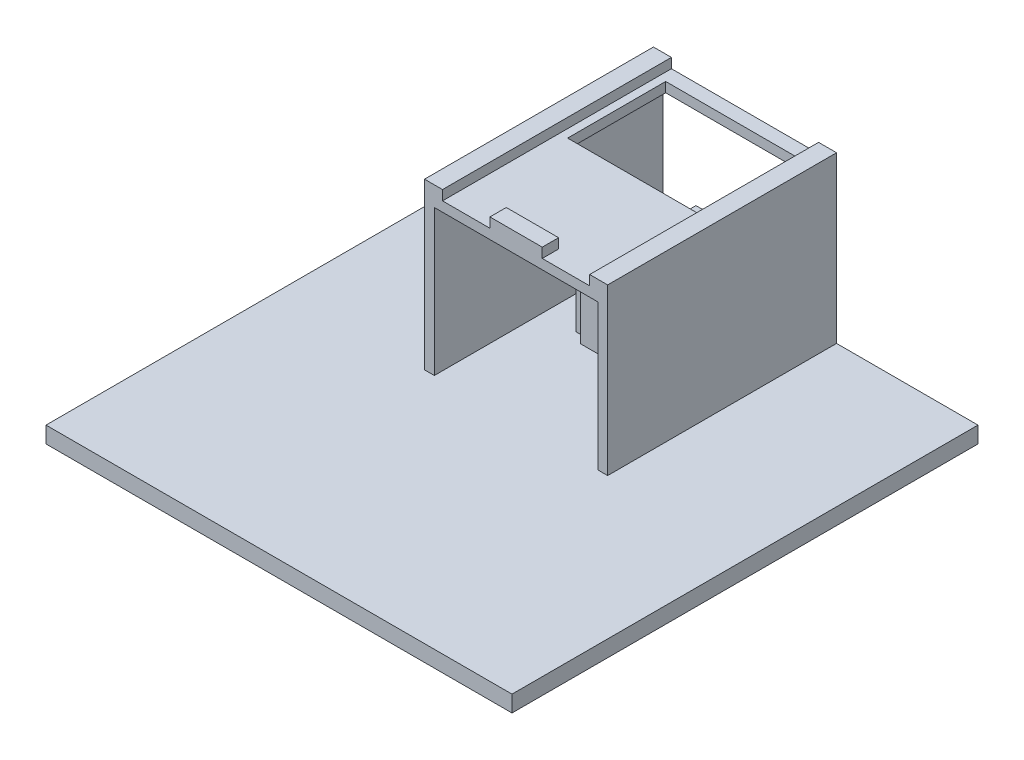
ISO-10303-21;
HEADER;
FILE_DESCRIPTION(('STEP AP214'),'2;1');
FILE_NAME('part.step','',(''),(''),'','','');
FILE_SCHEMA(('AUTOMOTIVE_DESIGN { 1 0 10303 214 1 1 1 1 }'));
ENDSEC;
DATA;
#1=APPLICATION_CONTEXT('core data for automotive mechanical design processes');
#2=APPLICATION_PROTOCOL_DEFINITION('international standard','automotive_design',2000,#1);
#3=PRODUCT_CONTEXT('',#1,'mechanical');
#4=PRODUCT('Part','Part','',(#3));
#5=PRODUCT_RELATED_PRODUCT_CATEGORY('part','',(#4));
#6=PRODUCT_DEFINITION_FORMATION('','',#4);
#7=PRODUCT_DEFINITION_CONTEXT('part definition',#1,'design');
#8=PRODUCT_DEFINITION('design','',#6,#7);
#9=PRODUCT_DEFINITION_SHAPE('','',#8);
#10=(LENGTH_UNIT() NAMED_UNIT(*) SI_UNIT(.MILLI.,.METRE.));
#11=(NAMED_UNIT(*) PLANE_ANGLE_UNIT() SI_UNIT($,.RADIAN.));
#12=(NAMED_UNIT(*) SI_UNIT($,.STERADIAN.) SOLID_ANGLE_UNIT());
#13=UNCERTAINTY_MEASURE_WITH_UNIT(LENGTH_MEASURE(1.E-05),#10,'distance_accuracy_value','');
#14=(GEOMETRIC_REPRESENTATION_CONTEXT(3) GLOBAL_UNCERTAINTY_ASSIGNED_CONTEXT((#13)) GLOBAL_UNIT_ASSIGNED_CONTEXT((#10,
#11,#12)) REPRESENTATION_CONTEXT('',''));
#15=CARTESIAN_POINT('',(0.,0.,0.));
#16=DIRECTION('',(0.,0.,1.));
#17=DIRECTION('',(1.,0.,0.));
#18=AXIS2_PLACEMENT_3D('',#15,#16,#17);
#19=CARTESIAN_POINT('',(9.,-3.6,28.));
#20=DIRECTION('',(0.,-1.,0.));
#21=DIRECTION('',(1.,0.,0.));
#22=AXIS2_PLACEMENT_3D('',#19,#20,#21);
#23=PLANE('',#22);
#24=DIRECTION('',(0.,0.,-1.));
#25=VECTOR('',#24,1.);
#26=CARTESIAN_POINT('',(-5.4,-3.6,15.7));
#27=LINE('',#26,#25);
#28=CARTESIAN_POINT('',(-5.4,-3.6,15.7));
#29=VERTEX_POINT('',#28);
#30=CARTESIAN_POINT('',(-5.4,-3.6,13.7));
#31=VERTEX_POINT('',#30);
#32=EDGE_CURVE('E366',#29,#31,#27,.T.);
#33=ORIENTED_EDGE('',*,*,#32,.F.);
#34=DIRECTION('',(1.,0.,0.));
#35=VECTOR('',#34,1.);
#36=CARTESIAN_POINT('',(3.4,-3.6,15.7));
#37=LINE('',#36,#35);
#38=CARTESIAN_POINT('',(3.4,-3.6,15.7));
#39=VERTEX_POINT('',#38);
#40=EDGE_CURVE('E358',#29,#39,#37,.T.);
#41=ORIENTED_EDGE('',*,*,#40,.T.);
#42=DIRECTION('',(0.,0.,-1.));
#43=VECTOR('',#42,1.);
#44=CARTESIAN_POINT('',(3.4,-3.6,15.7));
#45=LINE('',#44,#43);
#46=CARTESIAN_POINT('',(3.4,-3.6,13.7));
#47=VERTEX_POINT('',#46);
#48=EDGE_CURVE('E370',#39,#47,#45,.T.);
#49=ORIENTED_EDGE('',*,*,#48,.T.);
#50=DIRECTION('',(1.,0.,0.));
#51=VECTOR('',#50,1.);
#52=CARTESIAN_POINT('',(-9.,-3.6,13.7));
#53=LINE('',#52,#51);
#54=CARTESIAN_POINT('',(7.,-3.6,13.7));
#55=VERTEX_POINT('',#54);
#56=EDGE_CURVE('E379',#47,#55,#53,.T.);
#57=ORIENTED_EDGE('',*,*,#56,.T.);
#58=DIRECTION('',(0.,0.,-1.));
#59=VECTOR('',#58,1.);
#60=CARTESIAN_POINT('',(7.,-3.6,1.7));
#61=LINE('',#60,#59);
#62=CARTESIAN_POINT('',(7.,-3.6,1.7));
#63=VERTEX_POINT('',#62);
#64=EDGE_CURVE('E384',#55,#63,#61,.T.);
#65=ORIENTED_EDGE('',*,*,#64,.T.);
#66=DIRECTION('',(-1.,0.,0.));
#67=VECTOR('',#66,1.);
#68=CARTESIAN_POINT('',(-9.,-3.6,1.7));
#69=LINE('',#68,#67);
#70=CARTESIAN_POINT('',(-9.,-3.6,1.7));
#71=VERTEX_POINT('',#70);
#72=EDGE_CURVE('E387',#63,#71,#69,.T.);
#73=ORIENTED_EDGE('',*,*,#72,.T.);
#74=DIRECTION('',(0.,0.,1.));
#75=VECTOR('',#74,1.);
#76=CARTESIAN_POINT('',(-9.,-3.6,1.7));
#77=LINE('',#76,#75);
#78=CARTESIAN_POINT('',(-9.,-3.6,13.7));
#79=VERTEX_POINT('',#78);
#80=EDGE_CURVE('E376',#71,#79,#77,.T.);
#81=ORIENTED_EDGE('',*,*,#80,.T.);
#82=EDGE_CURVE('E381',#79,#31,#53,.T.);
#83=ORIENTED_EDGE('',*,*,#82,.T.);
#84=EDGE_LOOP('',(#33,#41,#49,#57,#65,#73,#81,#83));
#85=FACE_BOUND('',#84,.T.);
#86=DIRECTION('',(-1.,0.,0.));
#87=VECTOR('',#86,1.);
#88=CARTESIAN_POINT('',(9.,-3.6,0.));
#89=LINE('',#88,#87);
#90=CARTESIAN_POINT('',(9.,-3.6,0.));
#91=VERTEX_POINT('',#90);
#92=CARTESIAN_POINT('',(-11.,-3.6,0.));
#93=VERTEX_POINT('',#92);
#94=EDGE_CURVE('E417',#91,#93,#89,.T.);
#95=ORIENTED_EDGE('',*,*,#94,.F.);
#96=DIRECTION('',(0.,0.,-1.));
#97=VECTOR('',#96,1.);
#98=CARTESIAN_POINT('',(9.,-3.6,28.));
#99=LINE('',#98,#97);
#100=CARTESIAN_POINT('',(9.,-3.6,28.));
#101=VERTEX_POINT('',#100);
#102=EDGE_CURVE('E11',#101,#91,#99,.T.);
#103=ORIENTED_EDGE('',*,*,#102,.F.);
#104=DIRECTION('',(-1.,0.,0.));
#105=VECTOR('',#104,1.);
#106=CARTESIAN_POINT('',(9.,-3.6,28.));
#107=LINE('',#106,#105);
#108=CARTESIAN_POINT('',(-11.,-3.6,28.));
#109=VERTEX_POINT('',#108);
#110=EDGE_CURVE('E419',#101,#109,#107,.T.);
#111=ORIENTED_EDGE('',*,*,#110,.T.);
#112=DIRECTION('',(0.,0.,-1.));
#113=VECTOR('',#112,1.);
#114=CARTESIAN_POINT('',(-11.,-3.6,28.));
#115=LINE('',#114,#113);
#116=EDGE_CURVE('E42',#109,#93,#115,.T.);
#117=ORIENTED_EDGE('',*,*,#116,.T.);
#118=EDGE_LOOP('',(#95,#103,#111,#117));
#119=FACE_BOUND('',#118,.T.);
#120=ADVANCED_FACE('F39',(#85,#119),#23,.T.);
#121=CARTESIAN_POINT('',(9.,-3.6,28.));
#122=DIRECTION('',(1.,0.,0.));
#123=DIRECTION('',(0.,1.,0.));
#124=AXIS2_PLACEMENT_3D('',#121,#122,#123);
#125=PLANE('',#124);
#126=DIRECTION('',(0.,-1.,0.));
#127=VECTOR('',#126,1.);
#128=CARTESIAN_POINT('',(9.,-3.6,0.));
#129=LINE('',#128,#127);
#130=CARTESIAN_POINT('',(9.,-21.4,0.));
#131=VERTEX_POINT('',#130);
#132=EDGE_CURVE('E423',#91,#131,#129,.T.);
#133=ORIENTED_EDGE('',*,*,#132,.T.);
#134=DIRECTION('',(0.,0.,-1.));
#135=VECTOR('',#134,1.);
#136=CARTESIAN_POINT('',(9.,-21.4,28.));
#137=LINE('',#136,#135);
#138=CARTESIAN_POINT('',(9.,-21.4,28.));
#139=VERTEX_POINT('',#138);
#140=EDGE_CURVE('E47',#139,#131,#137,.T.);
#141=ORIENTED_EDGE('',*,*,#140,.F.);
#142=DIRECTION('',(0.,-1.,0.));
#143=VECTOR('',#142,1.);
#144=CARTESIAN_POINT('',(9.,-3.6,28.));
#145=LINE('',#144,#143);
#146=EDGE_CURVE('E458',#101,#139,#145,.T.);
#147=ORIENTED_EDGE('',*,*,#146,.F.);
#148=ORIENTED_EDGE('',*,*,#102,.T.);
#149=EDGE_LOOP('',(#133,#141,#147,#148));
#150=FACE_BOUND('',#149,.T.);
#151=ADVANCED_FACE('F540',(#150),#125,.F.);
#152=CARTESIAN_POINT('',(10.2,-1.2,28.));
#153=DIRECTION('',(1.,0.,0.));
#154=DIRECTION('',(0.,1.,0.));
#155=AXIS2_PLACEMENT_3D('',#152,#153,#154);
#156=PLANE('',#155);
#157=DIRECTION('',(0.,-1.,0.));
#158=VECTOR('',#157,1.);
#159=CARTESIAN_POINT('',(10.2,-1.2,0.));
#160=LINE('',#159,#158);
#161=CARTESIAN_POINT('',(10.2,-1.2,0.));
#162=VERTEX_POINT('',#161);
#163=CARTESIAN_POINT('',(10.2,-21.4,0.));
#164=VERTEX_POINT('',#163);
#165=EDGE_CURVE('E480',#162,#164,#160,.T.);
#166=ORIENTED_EDGE('',*,*,#165,.F.);
#167=DIRECTION('',(0.,0.,-1.));
#168=VECTOR('',#167,1.);
#169=CARTESIAN_POINT('',(10.2,-1.2,28.));
#170=LINE('',#169,#168);
#171=CARTESIAN_POINT('',(10.2,-1.2,28.));
#172=VERTEX_POINT('',#171);
#173=EDGE_CURVE('E490',#172,#162,#170,.T.);
#174=ORIENTED_EDGE('',*,*,#173,.F.);
#175=DIRECTION('',(0.,-1.,0.));
#176=VECTOR('',#175,1.);
#177=CARTESIAN_POINT('',(10.2,-1.2,28.));
#178=LINE('',#177,#176);
#179=CARTESIAN_POINT('',(10.2,-21.4,28.));
#180=VERTEX_POINT('',#179);
#181=EDGE_CURVE('E453',#172,#180,#178,.T.);
#182=ORIENTED_EDGE('',*,*,#181,.T.);
#183=DIRECTION('',(0.,0.,-1.));
#184=VECTOR('',#183,1.);
#185=CARTESIAN_POINT('',(10.2,-21.4,28.));
#186=LINE('',#185,#184);
#187=EDGE_CURVE('E487',#180,#164,#186,.T.);
#188=ORIENTED_EDGE('',*,*,#187,.T.);
#189=EDGE_LOOP('',(#166,#174,#182,#188));
#190=FACE_BOUND('',#189,.T.);
#191=ADVANCED_FACE('F551',(#190),#156,.T.);
#192=CARTESIAN_POINT('',(8.,-1.2,28.));
#193=DIRECTION('',(0.,1.,0.));
#194=DIRECTION('',(-1.,0.,0.));
#195=AXIS2_PLACEMENT_3D('',#192,#193,#194);
#196=PLANE('',#195);
#197=DIRECTION('',(1.,0.,0.));
#198=VECTOR('',#197,1.);
#199=CARTESIAN_POINT('',(8.,-1.2,0.));
#200=LINE('',#199,#198);
#201=CARTESIAN_POINT('',(8.,-1.2,0.));
#202=VERTEX_POINT('',#201);
#203=EDGE_CURVE('E477',#202,#162,#200,.T.);
#204=ORIENTED_EDGE('',*,*,#203,.F.);
#205=DIRECTION('',(0.,0.,-1.));
#206=VECTOR('',#205,1.);
#207=CARTESIAN_POINT('',(8.,-1.2,28.));
#208=LINE('',#207,#206);
#209=CARTESIAN_POINT('',(8.,-1.2,28.));
#210=VERTEX_POINT('',#209);
#211=EDGE_CURVE('E492',#210,#202,#208,.T.);
#212=ORIENTED_EDGE('',*,*,#211,.F.);
#213=DIRECTION('',(1.,0.,0.));
#214=VECTOR('',#213,1.);
#215=CARTESIAN_POINT('',(8.,-1.2,28.));
#216=LINE('',#215,#214);
#217=EDGE_CURVE('E450',#210,#172,#216,.T.);
#218=ORIENTED_EDGE('',*,*,#217,.T.);
#219=ORIENTED_EDGE('',*,*,#173,.T.);
#220=EDGE_LOOP('',(#204,#212,#218,#219));
#221=FACE_BOUND('',#220,.T.);
#222=ADVANCED_FACE('F557',(#221),#196,.T.);
#223=CARTESIAN_POINT('',(8.,-2.4,28.));
#224=DIRECTION('',(-1.,0.,0.));
#225=DIRECTION('',(0.,0.,1.));
#226=AXIS2_PLACEMENT_3D('',#223,#224,#225);
#227=PLANE('',#226);
#228=DIRECTION('',(0.,1.,0.));
#229=VECTOR('',#228,1.);
#230=CARTESIAN_POINT('',(8.,-2.4,0.));
#231=LINE('',#230,#229);
#232=CARTESIAN_POINT('',(8.,-2.4,0.));
#233=VERTEX_POINT('',#232);
#234=EDGE_CURVE('E474',#233,#202,#231,.T.);
#235=ORIENTED_EDGE('',*,*,#234,.F.);
#236=DIRECTION('',(0.,0.,-1.));
#237=VECTOR('',#236,1.);
#238=CARTESIAN_POINT('',(8.,-2.4,28.));
#239=LINE('',#238,#237);
#240=CARTESIAN_POINT('',(8.,-2.4,28.));
#241=VERTEX_POINT('',#240);
#242=EDGE_CURVE('E494',#241,#233,#239,.T.);
#243=ORIENTED_EDGE('',*,*,#242,.F.);
#244=DIRECTION('',(0.,1.,0.));
#245=VECTOR('',#244,1.);
#246=CARTESIAN_POINT('',(8.,-2.4,28.));
#247=LINE('',#246,#245);
#248=EDGE_CURVE('E447',#241,#210,#247,.T.);
#249=ORIENTED_EDGE('',*,*,#248,.T.);
#250=ORIENTED_EDGE('',*,*,#211,.T.);
#251=EDGE_LOOP('',(#235,#243,#249,#250));
#252=FACE_BOUND('',#251,.T.);
#253=ADVANCED_FACE('F560',(#252),#227,.T.);
#254=CARTESIAN_POINT('',(2.2,-2.4,28.));
#255=DIRECTION('',(0.,1.,0.));
#256=DIRECTION('',(-1.,0.,0.));
#257=AXIS2_PLACEMENT_3D('',#254,#255,#256);
#258=PLANE('',#257);
#259=DIRECTION('',(0.,0.,1.));
#260=VECTOR('',#259,1.);
#261=CARTESIAN_POINT('',(-9.,-2.4,1.7));
#262=LINE('',#261,#260);
#263=CARTESIAN_POINT('',(-9.,-2.4,1.7));
#264=VERTEX_POINT('',#263);
#265=CARTESIAN_POINT('',(-9.,-2.4,13.7));
#266=VERTEX_POINT('',#265);
#267=EDGE_CURVE('E373',#264,#266,#262,.T.);
#268=ORIENTED_EDGE('',*,*,#267,.F.);
#269=DIRECTION('',(-1.,0.,0.));
#270=VECTOR('',#269,1.);
#271=CARTESIAN_POINT('',(-9.,-2.4,1.7));
#272=LINE('',#271,#270);
#273=CARTESIAN_POINT('',(7.,-2.4,1.7));
#274=VERTEX_POINT('',#273);
#275=EDGE_CURVE('E380',#274,#264,#272,.T.);
#276=ORIENTED_EDGE('',*,*,#275,.F.);
#277=DIRECTION('',(0.,0.,-1.));
#278=VECTOR('',#277,1.);
#279=CARTESIAN_POINT('',(7.,-2.4,1.7));
#280=LINE('',#279,#278);
#281=CARTESIAN_POINT('',(7.,-2.4,13.7));
#282=VERTEX_POINT('',#281);
#283=EDGE_CURVE('E395',#282,#274,#280,.T.);
#284=ORIENTED_EDGE('',*,*,#283,.F.);
#285=DIRECTION('',(1.,0.,0.));
#286=VECTOR('',#285,1.);
#287=CARTESIAN_POINT('',(-9.,-2.4,13.7));
#288=LINE('',#287,#286);
#289=EDGE_CURVE('E392',#266,#282,#288,.T.);
#290=ORIENTED_EDGE('',*,*,#289,.F.);
#291=EDGE_LOOP('',(#268,#276,#284,#290));
#292=FACE_BOUND('',#291,.T.);
#293=DIRECTION('',(1.,0.,0.));
#294=VECTOR('',#293,1.);
#295=CARTESIAN_POINT('',(2.2,-2.4,0.));
#296=LINE('',#295,#294);
#297=CARTESIAN_POINT('',(-10.,-2.4,0.));
#298=VERTEX_POINT('',#297);
#299=EDGE_CURVE('E471',#298,#233,#296,.T.);
#300=ORIENTED_EDGE('',*,*,#299,.F.);
#301=DIRECTION('',(0.,0.,-1.));
#302=VECTOR('',#301,1.);
#303=CARTESIAN_POINT('',(-10.,-2.4,28.));
#304=LINE('',#303,#302);
#305=CARTESIAN_POINT('',(-10.,-2.4,28.));
#306=VERTEX_POINT('',#305);
#307=EDGE_CURVE('E508',#306,#298,#304,.T.);
#308=ORIENTED_EDGE('',*,*,#307,.F.);
#309=DIRECTION('',(-1.,0.,0.));
#310=VECTOR('',#309,1.);
#311=CARTESIAN_POINT('',(-4.2,-2.4,28.));
#312=LINE('',#311,#310);
#313=CARTESIAN_POINT('',(-4.2,-2.4,28.));
#314=VERTEX_POINT('',#313);
#315=EDGE_CURVE('E434',#314,#306,#312,.T.);
#316=ORIENTED_EDGE('',*,*,#315,.F.);
#317=DIRECTION('',(0.,0.,-1.));
#318=VECTOR('',#317,1.);
#319=CARTESIAN_POINT('',(-4.2,-2.4,28.));
#320=LINE('',#319,#318);
#321=CARTESIAN_POINT('',(-4.2,-2.4,26.));
#322=VERTEX_POINT('',#321);
#323=EDGE_CURVE('E505',#314,#322,#320,.T.);
#324=ORIENTED_EDGE('',*,*,#323,.T.);
#325=DIRECTION('',(1.,0.,0.));
#326=VECTOR('',#325,1.);
#327=CARTESIAN_POINT('',(-4.2,-2.4,26.));
#328=LINE('',#327,#326);
#329=CARTESIAN_POINT('',(2.2,-2.4,26.));
#330=VERTEX_POINT('',#329);
#331=EDGE_CURVE('E409',#322,#330,#328,.T.);
#332=ORIENTED_EDGE('',*,*,#331,.T.);
#333=DIRECTION('',(0.,0.,-1.));
#334=VECTOR('',#333,1.);
#335=CARTESIAN_POINT('',(2.2,-2.4,28.));
#336=LINE('',#335,#334);
#337=CARTESIAN_POINT('',(2.2,-2.4,28.));
#338=VERTEX_POINT('',#337);
#339=EDGE_CURVE('E496',#338,#330,#336,.T.);
#340=ORIENTED_EDGE('',*,*,#339,.F.);
#341=DIRECTION('',(1.,0.,0.));
#342=VECTOR('',#341,1.);
#343=CARTESIAN_POINT('',(2.2,-2.4,28.));
#344=LINE('',#343,#342);
#345=EDGE_CURVE('E444',#338,#241,#344,.T.);
#346=ORIENTED_EDGE('',*,*,#345,.T.);
#347=ORIENTED_EDGE('',*,*,#242,.T.);
#348=EDGE_LOOP('',(#300,#308,#316,#324,#332,#340,#346,#347));
#349=FACE_BOUND('',#348,.T.);
#350=ADVANCED_FACE('F564',(#292,#349),#258,.T.);
#351=CARTESIAN_POINT('',(2.2,-1.2,28.));
#352=DIRECTION('',(1.,0.,0.));
#353=DIRECTION('',(0.,0.,-1.));
#354=AXIS2_PLACEMENT_3D('',#351,#352,#353);
#355=PLANE('',#354);
#356=DIRECTION('',(0.,1.,0.));
#357=VECTOR('',#356,1.);
#358=CARTESIAN_POINT('',(2.2,-2.4,26.));
#359=LINE('',#358,#357);
#360=CARTESIAN_POINT('',(2.2,-1.2,26.));
#361=VERTEX_POINT('',#360);
#362=EDGE_CURVE('E414',#330,#361,#359,.T.);
#363=ORIENTED_EDGE('',*,*,#362,.T.);
#364=DIRECTION('',(0.,0.,-1.));
#365=VECTOR('',#364,1.);
#366=CARTESIAN_POINT('',(2.2,-1.2,28.));
#367=LINE('',#366,#365);
#368=CARTESIAN_POINT('',(2.2,-1.2,28.));
#369=VERTEX_POINT('',#368);
#370=EDGE_CURVE('E499',#369,#361,#367,.T.);
#371=ORIENTED_EDGE('',*,*,#370,.F.);
#372=DIRECTION('',(0.,-1.,0.));
#373=VECTOR('',#372,1.);
#374=CARTESIAN_POINT('',(2.2,-1.2,28.));
#375=LINE('',#374,#373);
#376=EDGE_CURVE('E441',#369,#338,#375,.T.);
#377=ORIENTED_EDGE('',*,*,#376,.T.);
#378=ORIENTED_EDGE('',*,*,#339,.T.);
#379=EDGE_LOOP('',(#363,#371,#377,#378));
#380=FACE_BOUND('',#379,.T.);
#381=ADVANCED_FACE('F566',(#380),#355,.T.);
#382=CARTESIAN_POINT('',(-4.2,-1.2,28.));
#383=DIRECTION('',(0.,1.,0.));
#384=DIRECTION('',(-1.,0.,0.));
#385=AXIS2_PLACEMENT_3D('',#382,#383,#384);
#386=PLANE('',#385);
#387=DIRECTION('',(1.,0.,0.));
#388=VECTOR('',#387,1.);
#389=CARTESIAN_POINT('',(-4.2,-1.2,26.));
#390=LINE('',#389,#388);
#391=CARTESIAN_POINT('',(-4.2,-1.2,26.));
#392=VERTEX_POINT('',#391);
#393=EDGE_CURVE('E402',#392,#361,#390,.T.);
#394=ORIENTED_EDGE('',*,*,#393,.F.);
#395=DIRECTION('',(0.,0.,-1.));
#396=VECTOR('',#395,1.);
#397=CARTESIAN_POINT('',(-4.2,-1.2,28.));
#398=LINE('',#397,#396);
#399=CARTESIAN_POINT('',(-4.2,-1.2,28.));
#400=VERTEX_POINT('',#399);
#401=EDGE_CURVE('E502',#400,#392,#398,.T.);
#402=ORIENTED_EDGE('',*,*,#401,.F.);
#403=DIRECTION('',(1.,0.,0.));
#404=VECTOR('',#403,1.);
#405=CARTESIAN_POINT('',(-4.2,-1.2,28.));
#406=LINE('',#405,#404);
#407=EDGE_CURVE('E438',#400,#369,#406,.T.);
#408=ORIENTED_EDGE('',*,*,#407,.T.);
#409=ORIENTED_EDGE('',*,*,#370,.T.);
#410=EDGE_LOOP('',(#394,#402,#408,#409));
#411=FACE_BOUND('',#410,.T.);
#412=ADVANCED_FACE('F570',(#411),#386,.T.);
#413=CARTESIAN_POINT('',(-4.2,-1.2,28.));
#414=DIRECTION('',(1.,0.,0.));
#415=DIRECTION('',(0.,0.,-1.));
#416=AXIS2_PLACEMENT_3D('',#413,#414,#415);
#417=PLANE('',#416);
#418=ORIENTED_EDGE('',*,*,#401,.T.);
#419=DIRECTION('',(0.,1.,0.));
#420=VECTOR('',#419,1.);
#421=CARTESIAN_POINT('',(-4.2,-2.4,26.));
#422=LINE('',#421,#420);
#423=EDGE_CURVE('E412',#322,#392,#422,.T.);
#424=ORIENTED_EDGE('',*,*,#423,.F.);
#425=ORIENTED_EDGE('',*,*,#323,.F.);
#426=DIRECTION('',(0.,-1.,0.));
#427=VECTOR('',#426,1.);
#428=CARTESIAN_POINT('',(-4.2,-1.2,28.));
#429=LINE('',#428,#427);
#430=EDGE_CURVE('E436',#400,#314,#429,.T.);
#431=ORIENTED_EDGE('',*,*,#430,.F.);
#432=EDGE_LOOP('',(#418,#424,#425,#431));
#433=FACE_BOUND('',#432,.T.);
#434=ADVANCED_FACE('F575',(#433),#417,.F.);
#435=CARTESIAN_POINT('',(-10.,-2.4,28.));
#436=DIRECTION('',(-1.,0.,0.));
#437=DIRECTION('',(0.,0.,1.));
#438=AXIS2_PLACEMENT_3D('',#435,#436,#437);
#439=PLANE('',#438);
#440=DIRECTION('',(0.,1.,0.));
#441=VECTOR('',#440,1.);
#442=CARTESIAN_POINT('',(-10.,-2.4,0.));
#443=LINE('',#442,#441);
#444=CARTESIAN_POINT('',(-10.,-1.2,0.));
#445=VERTEX_POINT('',#444);
#446=EDGE_CURVE('E469',#298,#445,#443,.T.);
#447=ORIENTED_EDGE('',*,*,#446,.T.);
#448=DIRECTION('',(0.,0.,-1.));
#449=VECTOR('',#448,1.);
#450=CARTESIAN_POINT('',(-10.,-1.2,28.));
#451=LINE('',#450,#449);
#452=CARTESIAN_POINT('',(-10.,-1.2,28.));
#453=VERTEX_POINT('',#452);
#454=EDGE_CURVE('E511',#453,#445,#451,.T.);
#455=ORIENTED_EDGE('',*,*,#454,.F.);
#456=DIRECTION('',(0.,1.,0.));
#457=VECTOR('',#456,1.);
#458=CARTESIAN_POINT('',(-10.,-2.4,28.));
#459=LINE('',#458,#457);
#460=EDGE_CURVE('E432',#306,#453,#459,.T.);
#461=ORIENTED_EDGE('',*,*,#460,.F.);
#462=ORIENTED_EDGE('',*,*,#307,.T.);
#463=EDGE_LOOP('',(#447,#455,#461,#462));
#464=FACE_BOUND('',#463,.T.);
#465=ADVANCED_FACE('F581',(#464),#439,.F.);
#466=CARTESIAN_POINT('',(-10.,-1.2,28.));
#467=DIRECTION('',(0.,-1.,0.));
#468=DIRECTION('',(1.,0.,0.));
#469=AXIS2_PLACEMENT_3D('',#466,#467,#468);
#470=PLANE('',#469);
#471=DIRECTION('',(-1.,0.,0.));
#472=VECTOR('',#471,1.);
#473=CARTESIAN_POINT('',(-10.,-1.2,0.));
#474=LINE('',#473,#472);
#475=CARTESIAN_POINT('',(-12.2,-1.2,0.));
#476=VERTEX_POINT('',#475);
#477=EDGE_CURVE('E467',#445,#476,#474,.T.);
#478=ORIENTED_EDGE('',*,*,#477,.T.);
#479=DIRECTION('',(0.,0.,-1.));
#480=VECTOR('',#479,1.);
#481=CARTESIAN_POINT('',(-12.2,-1.2,28.));
#482=LINE('',#481,#480);
#483=CARTESIAN_POINT('',(-12.2,-1.2,28.));
#484=VERTEX_POINT('',#483);
#485=EDGE_CURVE('E514',#484,#476,#482,.T.);
#486=ORIENTED_EDGE('',*,*,#485,.F.);
#487=DIRECTION('',(-1.,0.,0.));
#488=VECTOR('',#487,1.);
#489=CARTESIAN_POINT('',(-10.,-1.2,28.));
#490=LINE('',#489,#488);
#491=EDGE_CURVE('E430',#453,#484,#490,.T.);
#492=ORIENTED_EDGE('',*,*,#491,.F.);
#493=ORIENTED_EDGE('',*,*,#454,.T.);
#494=EDGE_LOOP('',(#478,#486,#492,#493));
#495=FACE_BOUND('',#494,.T.);
#496=ADVANCED_FACE('F586',(#495),#470,.F.);
#497=CARTESIAN_POINT('',(-12.2,-1.2,28.));
#498=DIRECTION('',(1.,0.,0.));
#499=DIRECTION('',(0.,1.,0.));
#500=AXIS2_PLACEMENT_3D('',#497,#498,#499);
#501=PLANE('',#500);
#502=DIRECTION('',(0.,-1.,0.));
#503=VECTOR('',#502,1.);
#504=CARTESIAN_POINT('',(-12.2,-1.2,0.));
#505=LINE('',#504,#503);
#506=CARTESIAN_POINT('',(-12.2,-21.4,0.));
#507=VERTEX_POINT('',#506);
#508=EDGE_CURVE('E465',#476,#507,#505,.T.);
#509=ORIENTED_EDGE('',*,*,#508,.T.);
#510=DIRECTION('',(0.,0.,-1.));
#511=VECTOR('',#510,1.);
#512=CARTESIAN_POINT('',(-12.2,-21.4,28.));
#513=LINE('',#512,#511);
#514=CARTESIAN_POINT('',(-12.2,-21.4,28.));
#515=VERTEX_POINT('',#514);
#516=EDGE_CURVE('E517',#515,#507,#513,.T.);
#517=ORIENTED_EDGE('',*,*,#516,.F.);
#518=DIRECTION('',(0.,-1.,0.));
#519=VECTOR('',#518,1.);
#520=CARTESIAN_POINT('',(-12.2,-1.2,28.));
#521=LINE('',#520,#519);
#522=EDGE_CURVE('E428',#484,#515,#521,.T.);
#523=ORIENTED_EDGE('',*,*,#522,.F.);
#524=ORIENTED_EDGE('',*,*,#485,.T.);
#525=EDGE_LOOP('',(#509,#517,#523,#524));
#526=FACE_BOUND('',#525,.T.);
#527=ADVANCED_FACE('F590',(#526),#501,.F.);
#528=CARTESIAN_POINT('',(-11.,-3.6,28.));
#529=DIRECTION('',(1.,0.,0.));
#530=DIRECTION('',(0.,0.,-1.));
#531=AXIS2_PLACEMENT_3D('',#528,#529,#530);
#532=PLANE('',#531);
#533=DIRECTION('',(0.,-1.,0.));
#534=VECTOR('',#533,1.);
#535=CARTESIAN_POINT('',(-11.,-3.6,0.));
#536=LINE('',#535,#534);
#537=CARTESIAN_POINT('',(-11.,-21.4,0.));
#538=VERTEX_POINT('',#537);
#539=EDGE_CURVE('E463',#93,#538,#536,.T.);
#540=ORIENTED_EDGE('',*,*,#539,.F.);
#541=ORIENTED_EDGE('',*,*,#116,.F.);
#542=DIRECTION('',(0.,-1.,0.));
#543=VECTOR('',#542,1.);
#544=CARTESIAN_POINT('',(-11.,-3.6,28.));
#545=LINE('',#544,#543);
#546=CARTESIAN_POINT('',(-11.,-21.4,28.));
#547=VERTEX_POINT('',#546);
#548=EDGE_CURVE('E422',#109,#547,#545,.T.);
#549=ORIENTED_EDGE('',*,*,#548,.T.);
#550=DIRECTION('',(0.,0.,-1.));
#551=VECTOR('',#550,1.);
#552=CARTESIAN_POINT('',(-11.,-21.4,28.));
#553=LINE('',#552,#551);
#554=EDGE_CURVE('E519',#547,#538,#553,.T.);
#555=ORIENTED_EDGE('',*,*,#554,.T.);
#556=EDGE_LOOP('',(#540,#541,#549,#555));
#557=FACE_BOUND('',#556,.T.);
#558=ADVANCED_FACE('F529',(#557),#532,.T.);
#559=CARTESIAN_POINT('',(0.,0.,28.));
#560=DIRECTION('',(0.,0.,1.));
#561=DIRECTION('',(1.,0.,0.));
#562=AXIS2_PLACEMENT_3D('',#559,#560,#561);
#563=PLANE('',#562);
#564=ORIENTED_EDGE('',*,*,#110,.F.);
#565=ORIENTED_EDGE('',*,*,#146,.T.);
#566=DIRECTION('',(-1.,0.,0.));
#567=VECTOR('',#566,1.);
#568=CARTESIAN_POINT('',(10.2,-21.4,28.));
#569=LINE('',#568,#567);
#570=EDGE_CURVE('E456',#180,#139,#569,.T.);
#571=ORIENTED_EDGE('',*,*,#570,.F.);
#572=ORIENTED_EDGE('',*,*,#181,.F.);
#573=ORIENTED_EDGE('',*,*,#217,.F.);
#574=ORIENTED_EDGE('',*,*,#248,.F.);
#575=ORIENTED_EDGE('',*,*,#345,.F.);
#576=ORIENTED_EDGE('',*,*,#376,.F.);
#577=ORIENTED_EDGE('',*,*,#407,.F.);
#578=ORIENTED_EDGE('',*,*,#430,.T.);
#579=ORIENTED_EDGE('',*,*,#315,.T.);
#580=ORIENTED_EDGE('',*,*,#460,.T.);
#581=ORIENTED_EDGE('',*,*,#491,.T.);
#582=ORIENTED_EDGE('',*,*,#522,.T.);
#583=DIRECTION('',(1.,0.,0.));
#584=VECTOR('',#583,1.);
#585=CARTESIAN_POINT('',(-12.2,-21.4,28.));
#586=LINE('',#585,#584);
#587=EDGE_CURVE('E426',#515,#547,#586,.T.);
#588=ORIENTED_EDGE('',*,*,#587,.T.);
#589=ORIENTED_EDGE('',*,*,#548,.F.);
#590=EDGE_LOOP('',(#564,#565,#571,#572,#573,#574,#575,#576,#577,#578,#579,#580,#581,#582,#588,#589));
#591=FACE_BOUND('',#590,.T.);
#592=ADVANCED_FACE('F544',(#591),#563,.T.);
#593=CARTESIAN_POINT('',(0.,0.,0.));
#594=DIRECTION('',(0.,0.,1.));
#595=DIRECTION('',(1.,0.,0.));
#596=AXIS2_PLACEMENT_3D('',#593,#594,#595);
#597=PLANE('',#596);
#598=DIRECTION('',(1.,0.,0.));
#599=VECTOR('',#598,1.);
#600=CARTESIAN_POINT('',(-1.,-21.4,0.));
#601=LINE('',#600,#599);
#602=CARTESIAN_POINT('',(5.,-21.4,0.));
#603=VERTEX_POINT('',#602);
#604=EDGE_CURVE('E537',#603,#131,#601,.T.);
#605=ORIENTED_EDGE('',*,*,#604,.T.);
#606=ORIENTED_EDGE('',*,*,#132,.F.);
#607=ORIENTED_EDGE('',*,*,#94,.T.);
#608=ORIENTED_EDGE('',*,*,#539,.T.);
#609=CARTESIAN_POINT('',(-7.,-21.4,0.));
#610=VERTEX_POINT('',#609);
#611=EDGE_CURVE('E290',#538,#610,#601,.T.);
#612=ORIENTED_EDGE('',*,*,#611,.T.);
#613=DIRECTION('',(0.,-1.,0.));
#614=VECTOR('',#613,1.);
#615=CARTESIAN_POINT('',(-7.,-21.4,0.));
#616=LINE('',#615,#614);
#617=CARTESIAN_POINT('',(-7.,-15.4,0.));
#618=VERTEX_POINT('',#617);
#619=EDGE_CURVE('E333',#618,#610,#616,.T.);
#620=ORIENTED_EDGE('',*,*,#619,.F.);
#621=DIRECTION('',(-1.,0.,0.));
#622=VECTOR('',#621,1.);
#623=CARTESIAN_POINT('',(-7.,-15.4,0.));
#624=LINE('',#623,#622);
#625=CARTESIAN_POINT('',(5.,-15.4,0.));
#626=VERTEX_POINT('',#625);
#627=EDGE_CURVE('E330',#626,#618,#624,.T.);
#628=ORIENTED_EDGE('',*,*,#627,.F.);
#629=DIRECTION('',(0.,1.,0.));
#630=VECTOR('',#629,1.);
#631=CARTESIAN_POINT('',(5.,-15.4,0.));
#632=LINE('',#631,#630);
#633=EDGE_CURVE('E318',#603,#626,#632,.T.);
#634=ORIENTED_EDGE('',*,*,#633,.F.);
#635=EDGE_LOOP('',(#605,#606,#607,#608,#612,#620,#628,#634));
#636=FACE_BOUND('',#635,.T.);
#637=ORIENTED_EDGE('',*,*,#446,.F.);
#638=ORIENTED_EDGE('',*,*,#299,.T.);
#639=ORIENTED_EDGE('',*,*,#234,.T.);
#640=ORIENTED_EDGE('',*,*,#203,.T.);
#641=ORIENTED_EDGE('',*,*,#165,.T.);
#642=CARTESIAN_POINT('',(27.5,-21.4,0.));
#643=VERTEX_POINT('',#642);
#644=EDGE_CURVE('E292',#164,#643,#601,.T.);
#645=ORIENTED_EDGE('',*,*,#644,.T.);
#646=DIRECTION('',(0.,-1.,0.));
#647=VECTOR('',#646,1.);
#648=CARTESIAN_POINT('',(27.5,-21.4,0.));
#649=LINE('',#648,#647);
#650=CARTESIAN_POINT('',(27.5,-23.4,0.));
#651=VERTEX_POINT('',#650);
#652=EDGE_CURVE('E267',#643,#651,#649,.T.);
#653=ORIENTED_EDGE('',*,*,#652,.T.);
#654=DIRECTION('',(-1.,0.,0.));
#655=VECTOR('',#654,1.);
#656=CARTESIAN_POINT('',(27.5,-23.4,0.));
#657=LINE('',#656,#655);
#658=CARTESIAN_POINT('',(-29.5,-23.4,0.));
#659=VERTEX_POINT('',#658);
#660=EDGE_CURVE('E297',#651,#659,#657,.T.);
#661=ORIENTED_EDGE('',*,*,#660,.T.);
#662=DIRECTION('',(0.,1.,0.));
#663=VECTOR('',#662,1.);
#664=CARTESIAN_POINT('',(-29.5,-23.4,0.));
#665=LINE('',#664,#663);
#666=CARTESIAN_POINT('',(-29.5,-21.4,0.));
#667=VERTEX_POINT('',#666);
#668=EDGE_CURVE('E300',#659,#667,#665,.T.);
#669=ORIENTED_EDGE('',*,*,#668,.T.);
#670=EDGE_CURVE('E287',#667,#507,#601,.T.);
#671=ORIENTED_EDGE('',*,*,#670,.T.);
#672=ORIENTED_EDGE('',*,*,#508,.F.);
#673=ORIENTED_EDGE('',*,*,#477,.F.);
#674=EDGE_LOOP('',(#637,#638,#639,#640,#641,#645,#653,#661,#669,#671,#672,#673));
#675=FACE_BOUND('',#674,.T.);
#676=ADVANCED_FACE('F533',(#636,#675),#597,.F.);
#677=CARTESIAN_POINT('',(-4.2,-2.4,26.));
#678=DIRECTION('',(0.,0.,1.));
#679=DIRECTION('',(1.,0.,0.));
#680=AXIS2_PLACEMENT_3D('',#677,#678,#679);
#681=PLANE('',#680);
#682=ORIENTED_EDGE('',*,*,#393,.T.);
#683=ORIENTED_EDGE('',*,*,#362,.F.);
#684=ORIENTED_EDGE('',*,*,#331,.F.);
#685=ORIENTED_EDGE('',*,*,#423,.T.);
#686=EDGE_LOOP('',(#682,#683,#684,#685));
#687=FACE_BOUND('',#686,.T.);
#688=ADVANCED_FACE('F685',(#687),#681,.F.);
#689=CARTESIAN_POINT('',(-9.,-3.6,1.7));
#690=DIRECTION('',(-1.,0.,0.));
#691=DIRECTION('',(0.,-1.,0.));
#692=AXIS2_PLACEMENT_3D('',#689,#690,#691);
#693=PLANE('',#692);
#694=ORIENTED_EDGE('',*,*,#267,.T.);
#695=DIRECTION('',(0.,1.,0.));
#696=VECTOR('',#695,1.);
#697=CARTESIAN_POINT('',(-9.,-3.6,13.7));
#698=LINE('',#697,#696);
#699=EDGE_CURVE('E390',#79,#266,#698,.T.);
#700=ORIENTED_EDGE('',*,*,#699,.F.);
#701=ORIENTED_EDGE('',*,*,#80,.F.);
#702=DIRECTION('',(0.,1.,0.));
#703=VECTOR('',#702,1.);
#704=CARTESIAN_POINT('',(-9.,-3.6,1.7));
#705=LINE('',#704,#703);
#706=EDGE_CURVE('E400',#71,#264,#705,.T.);
#707=ORIENTED_EDGE('',*,*,#706,.T.);
#708=EDGE_LOOP('',(#694,#700,#701,#707));
#709=FACE_BOUND('',#708,.T.);
#710=ADVANCED_FACE('F642',(#709),#693,.F.);
#711=CARTESIAN_POINT('',(-9.,-3.6,1.7));
#712=DIRECTION('',(0.,0.,-1.));
#713=DIRECTION('',(-1.,0.,0.));
#714=AXIS2_PLACEMENT_3D('',#711,#712,#713);
#715=PLANE('',#714);
#716=ORIENTED_EDGE('',*,*,#275,.T.);
#717=ORIENTED_EDGE('',*,*,#706,.F.);
#718=ORIENTED_EDGE('',*,*,#72,.F.);
#719=DIRECTION('',(0.,1.,0.));
#720=VECTOR('',#719,1.);
#721=CARTESIAN_POINT('',(7.,-3.6,1.7));
#722=LINE('',#721,#720);
#723=EDGE_CURVE('E403',#63,#274,#722,.T.);
#724=ORIENTED_EDGE('',*,*,#723,.T.);
#725=EDGE_LOOP('',(#716,#717,#718,#724));
#726=FACE_BOUND('',#725,.T.);
#727=ADVANCED_FACE('F639',(#726),#715,.F.);
#728=CARTESIAN_POINT('',(7.,-3.6,1.7));
#729=DIRECTION('',(1.,0.,0.));
#730=DIRECTION('',(0.,0.,-1.));
#731=AXIS2_PLACEMENT_3D('',#728,#729,#730);
#732=PLANE('',#731);
#733=ORIENTED_EDGE('',*,*,#283,.T.);
#734=ORIENTED_EDGE('',*,*,#723,.F.);
#735=ORIENTED_EDGE('',*,*,#64,.F.);
#736=DIRECTION('',(0.,1.,0.));
#737=VECTOR('',#736,1.);
#738=CARTESIAN_POINT('',(7.,-3.6,13.7));
#739=LINE('',#738,#737);
#740=EDGE_CURVE('E405',#55,#282,#739,.T.);
#741=ORIENTED_EDGE('',*,*,#740,.T.);
#742=EDGE_LOOP('',(#733,#734,#735,#741));
#743=FACE_BOUND('',#742,.T.);
#744=ADVANCED_FACE('F630',(#743),#732,.F.);
#745=CARTESIAN_POINT('',(-9.,-3.6,13.7));
#746=DIRECTION('',(0.,0.,1.));
#747=DIRECTION('',(1.,0.,0.));
#748=AXIS2_PLACEMENT_3D('',#745,#746,#747);
#749=PLANE('',#748);
#750=DIRECTION('',(0.,-1.,0.));
#751=VECTOR('',#750,1.);
#752=CARTESIAN_POINT('',(3.4,-3.6,13.7));
#753=LINE('',#752,#751);
#754=CARTESIAN_POINT('',(3.4,-15.4,13.7));
#755=VERTEX_POINT('',#754);
#756=EDGE_CURVE('E359',#47,#755,#753,.T.);
#757=ORIENTED_EDGE('',*,*,#756,.T.);
#758=DIRECTION('',(-1.,0.,0.));
#759=VECTOR('',#758,1.);
#760=CARTESIAN_POINT('',(-9.,-15.4,13.7));
#761=LINE('',#760,#759);
#762=CARTESIAN_POINT('',(-5.4,-15.4,13.7));
#763=VERTEX_POINT('',#762);
#764=EDGE_CURVE('E350',#755,#763,#761,.T.);
#765=ORIENTED_EDGE('',*,*,#764,.T.);
#766=DIRECTION('',(0.,1.,0.));
#767=VECTOR('',#766,1.);
#768=CARTESIAN_POINT('',(-5.4,-21.4,13.7));
#769=LINE('',#768,#767);
#770=EDGE_CURVE('E355',#763,#31,#769,.T.);
#771=ORIENTED_EDGE('',*,*,#770,.T.);
#772=ORIENTED_EDGE('',*,*,#82,.F.);
#773=ORIENTED_EDGE('',*,*,#699,.T.);
#774=ORIENTED_EDGE('',*,*,#289,.T.);
#775=ORIENTED_EDGE('',*,*,#740,.F.);
#776=ORIENTED_EDGE('',*,*,#56,.F.);
#777=EDGE_LOOP('',(#757,#765,#771,#772,#773,#774,#775,#776));
#778=FACE_BOUND('',#777,.T.);
#779=ADVANCED_FACE('F632',(#778),#749,.F.);
#780=CARTESIAN_POINT('',(-5.4,-21.4,15.7));
#781=DIRECTION('',(-1.,0.,0.));
#782=DIRECTION('',(0.,0.,1.));
#783=AXIS2_PLACEMENT_3D('',#780,#781,#782);
#784=PLANE('',#783);
#785=DIRECTION('',(0.,0.,-1.));
#786=VECTOR('',#785,1.);
#787=CARTESIAN_POINT('',(-5.4,-15.4,15.7));
#788=LINE('',#787,#786);
#789=CARTESIAN_POINT('',(-5.4,-15.4,14.7));
#790=VERTEX_POINT('',#789);
#791=EDGE_CURVE('E353',#790,#763,#788,.T.);
#792=ORIENTED_EDGE('',*,*,#791,.F.);
#793=DIRECTION('',(0.,1.,0.));
#794=VECTOR('',#793,1.);
#795=CARTESIAN_POINT('',(-5.4,-15.4,14.7));
#796=LINE('',#795,#794);
#797=CARTESIAN_POINT('',(-5.4,-21.4,14.7));
#798=VERTEX_POINT('',#797);
#799=EDGE_CURVE('E55',#798,#790,#796,.T.);
#800=ORIENTED_EDGE('',*,*,#799,.F.);
#801=DIRECTION('',(0.,0.,1.));
#802=VECTOR('',#801,1.);
#803=CARTESIAN_POINT('',(-5.4,-21.4,14.7));
#804=LINE('',#803,#802);
#805=CARTESIAN_POINT('',(-5.4,-21.4,15.7));
#806=VERTEX_POINT('',#805);
#807=EDGE_CURVE('E316',#798,#806,#804,.T.);
#808=ORIENTED_EDGE('',*,*,#807,.T.);
#809=DIRECTION('',(0.,1.,0.));
#810=VECTOR('',#809,1.);
#811=CARTESIAN_POINT('',(-5.4,-21.4,15.7));
#812=LINE('',#811,#810);
#813=EDGE_CURVE('E356',#806,#29,#812,.T.);
#814=ORIENTED_EDGE('',*,*,#813,.T.);
#815=ORIENTED_EDGE('',*,*,#32,.T.);
#816=ORIENTED_EDGE('',*,*,#770,.F.);
#817=EDGE_LOOP('',(#792,#800,#808,#814,#815,#816));
#818=FACE_BOUND('',#817,.T.);
#819=ADVANCED_FACE('F645',(#818),#784,.T.);
#820=CARTESIAN_POINT('',(3.4,-3.6,15.7));
#821=DIRECTION('',(1.,0.,0.));
#822=DIRECTION('',(0.,1.,0.));
#823=AXIS2_PLACEMENT_3D('',#820,#821,#822);
#824=PLANE('',#823);
#825=DIRECTION('',(0.,0.,1.));
#826=VECTOR('',#825,1.);
#827=CARTESIAN_POINT('',(3.4,-15.4,15.7));
#828=LINE('',#827,#826);
#829=CARTESIAN_POINT('',(3.4,-15.4,14.7));
#830=VERTEX_POINT('',#829);
#831=EDGE_CURVE('E339',#755,#830,#828,.T.);
#832=ORIENTED_EDGE('',*,*,#831,.F.);
#833=ORIENTED_EDGE('',*,*,#756,.F.);
#834=ORIENTED_EDGE('',*,*,#48,.F.);
#835=DIRECTION('',(0.,-1.,0.));
#836=VECTOR('',#835,1.);
#837=CARTESIAN_POINT('',(3.4,-3.6,15.7));
#838=LINE('',#837,#836);
#839=CARTESIAN_POINT('',(3.4,-21.4,15.7));
#840=VERTEX_POINT('',#839);
#841=EDGE_CURVE('E361',#39,#840,#838,.T.);
#842=ORIENTED_EDGE('',*,*,#841,.T.);
#843=DIRECTION('',(0.,0.,1.));
#844=VECTOR('',#843,1.);
#845=CARTESIAN_POINT('',(3.4,-21.4,14.7));
#846=LINE('',#845,#844);
#847=CARTESIAN_POINT('',(3.4,-21.4,14.7));
#848=VERTEX_POINT('',#847);
#849=EDGE_CURVE('E311',#848,#840,#846,.T.);
#850=ORIENTED_EDGE('',*,*,#849,.F.);
#851=DIRECTION('',(0.,-1.,0.));
#852=VECTOR('',#851,1.);
#853=CARTESIAN_POINT('',(3.4,-21.4,14.7));
#854=LINE('',#853,#852);
#855=EDGE_CURVE('E304',#830,#848,#854,.T.);
#856=ORIENTED_EDGE('',*,*,#855,.F.);
#857=EDGE_LOOP('',(#832,#833,#834,#842,#850,#856));
#858=FACE_BOUND('',#857,.T.);
#859=ADVANCED_FACE('F624',(#858),#824,.T.);
#860=CARTESIAN_POINT('',(0.,0.,15.7));
#861=DIRECTION('',(0.,0.,1.));
#862=DIRECTION('',(1.,0.,0.));
#863=AXIS2_PLACEMENT_3D('',#860,#861,#862);
#864=PLANE('',#863);
#865=ORIENTED_EDGE('',*,*,#813,.F.);
#866=DIRECTION('',(-1.,0.,0.));
#867=VECTOR('',#866,1.);
#868=CARTESIAN_POINT('',(3.4,-21.4,15.7));
#869=LINE('',#868,#867);
#870=EDGE_CURVE('E363',#840,#806,#869,.T.);
#871=ORIENTED_EDGE('',*,*,#870,.F.);
#872=ORIENTED_EDGE('',*,*,#841,.F.);
#873=ORIENTED_EDGE('',*,*,#40,.F.);
#874=EDGE_LOOP('',(#865,#871,#872,#873));
#875=FACE_BOUND('',#874,.T.);
#876=ADVANCED_FACE('F621',(#875),#864,.T.);
#877=CARTESIAN_POINT('',(-7.,-21.4,0.));
#878=DIRECTION('',(-1.,0.,0.));
#879=DIRECTION('',(0.,0.,1.));
#880=AXIS2_PLACEMENT_3D('',#877,#878,#879);
#881=PLANE('',#880);
#882=DIRECTION('',(0.,-1.,0.));
#883=VECTOR('',#882,1.);
#884=CARTESIAN_POINT('',(-7.,-21.4,14.7));
#885=LINE('',#884,#883);
#886=CARTESIAN_POINT('',(-7.,-15.4,14.7));
#887=VERTEX_POINT('',#886);
#888=CARTESIAN_POINT('',(-7.,-21.4,14.7));
#889=VERTEX_POINT('',#888);
#890=EDGE_CURVE('E308',#887,#889,#885,.T.);
#891=ORIENTED_EDGE('',*,*,#890,.F.);
#892=DIRECTION('',(0.,0.,1.));
#893=VECTOR('',#892,1.);
#894=CARTESIAN_POINT('',(-7.,-15.4,0.));
#895=LINE('',#894,#893);
#896=EDGE_CURVE('E340',#618,#887,#895,.T.);
#897=ORIENTED_EDGE('',*,*,#896,.F.);
#898=ORIENTED_EDGE('',*,*,#619,.T.);
#899=DIRECTION('',(0.,0.,1.));
#900=VECTOR('',#899,1.);
#901=CARTESIAN_POINT('',(-7.,-21.4,0.));
#902=LINE('',#901,#900);
#903=EDGE_CURVE('E336',#610,#889,#902,.T.);
#904=ORIENTED_EDGE('',*,*,#903,.T.);
#905=EDGE_LOOP('',(#891,#897,#898,#904));
#906=FACE_BOUND('',#905,.T.);
#907=ADVANCED_FACE('F651',(#906),#881,.T.);
#908=CARTESIAN_POINT('',(-7.,-15.4,0.));
#909=DIRECTION('',(0.,1.,0.));
#910=DIRECTION('',(0.,0.,1.));
#911=AXIS2_PLACEMENT_3D('',#908,#909,#910);
#912=PLANE('',#911);
#913=DIRECTION('',(-1.,0.,0.));
#914=VECTOR('',#913,1.);
#915=CARTESIAN_POINT('',(-7.,-15.4,14.7));
#916=LINE('',#915,#914);
#917=EDGE_CURVE('E314',#790,#887,#916,.T.);
#918=ORIENTED_EDGE('',*,*,#917,.F.);
#919=ORIENTED_EDGE('',*,*,#791,.T.);
#920=ORIENTED_EDGE('',*,*,#764,.F.);
#921=ORIENTED_EDGE('',*,*,#831,.T.);
#922=DIRECTION('',(-1.,0.,0.));
#923=VECTOR('',#922,1.);
#924=CARTESIAN_POINT('',(3.4,-15.4,14.7));
#925=LINE('',#924,#923);
#926=CARTESIAN_POINT('',(5.,-15.4,14.7));
#927=VERTEX_POINT('',#926);
#928=EDGE_CURVE('E323',#927,#830,#925,.T.);
#929=ORIENTED_EDGE('',*,*,#928,.F.);
#930=DIRECTION('',(0.,0.,1.));
#931=VECTOR('',#930,1.);
#932=CARTESIAN_POINT('',(5.,-15.4,0.));
#933=LINE('',#932,#931);
#934=EDGE_CURVE('E343',#626,#927,#933,.T.);
#935=ORIENTED_EDGE('',*,*,#934,.F.);
#936=ORIENTED_EDGE('',*,*,#627,.T.);
#937=ORIENTED_EDGE('',*,*,#896,.T.);
#938=EDGE_LOOP('',(#918,#919,#920,#921,#929,#935,#936,#937));
#939=FACE_BOUND('',#938,.T.);
#940=ADVANCED_FACE('F647',(#939),#912,.T.);
#941=CARTESIAN_POINT('',(5.,-15.4,0.));
#942=DIRECTION('',(1.,0.,0.));
#943=DIRECTION('',(0.,0.,-1.));
#944=AXIS2_PLACEMENT_3D('',#941,#942,#943);
#945=PLANE('',#944);
#946=DIRECTION('',(0.,1.,0.));
#947=VECTOR('',#946,1.);
#948=CARTESIAN_POINT('',(5.,-15.4,14.7));
#949=LINE('',#948,#947);
#950=CARTESIAN_POINT('',(5.,-21.4,14.7));
#951=VERTEX_POINT('',#950);
#952=EDGE_CURVE('E321',#951,#927,#949,.T.);
#953=ORIENTED_EDGE('',*,*,#952,.F.);
#954=DIRECTION('',(0.,0.,1.));
#955=VECTOR('',#954,1.);
#956=CARTESIAN_POINT('',(5.,-21.4,0.));
#957=LINE('',#956,#955);
#958=EDGE_CURVE('E335',#603,#951,#957,.T.);
#959=ORIENTED_EDGE('',*,*,#958,.F.);
#960=ORIENTED_EDGE('',*,*,#633,.T.);
#961=ORIENTED_EDGE('',*,*,#934,.T.);
#962=EDGE_LOOP('',(#953,#959,#960,#961));
#963=FACE_BOUND('',#962,.T.);
#964=ADVANCED_FACE('F654',(#963),#945,.T.);
#965=CARTESIAN_POINT('',(0.,0.,14.7));
#966=DIRECTION('',(0.,0.,-1.));
#967=DIRECTION('',(-1.,0.,0.));
#968=AXIS2_PLACEMENT_3D('',#965,#966,#967);
#969=PLANE('',#968);
#970=ORIENTED_EDGE('',*,*,#855,.T.);
#971=DIRECTION('',(1.,0.,0.));
#972=VECTOR('',#971,1.);
#973=CARTESIAN_POINT('',(5.,-21.4,14.7));
#974=LINE('',#973,#972);
#975=EDGE_CURVE('E63',#848,#951,#974,.T.);
#976=ORIENTED_EDGE('',*,*,#975,.T.);
#977=ORIENTED_EDGE('',*,*,#952,.T.);
#978=ORIENTED_EDGE('',*,*,#928,.T.);
#979=EDGE_LOOP('',(#970,#976,#977,#978));
#980=FACE_BOUND('',#979,.T.);
#981=ADVANCED_FACE('F657',(#980),#969,.F.);
#982=CARTESIAN_POINT('',(0.,0.,14.7));
#983=DIRECTION('',(0.,0.,-1.));
#984=DIRECTION('',(-1.,0.,0.));
#985=AXIS2_PLACEMENT_3D('',#982,#983,#984);
#986=PLANE('',#985);
#987=ORIENTED_EDGE('',*,*,#890,.T.);
#988=DIRECTION('',(1.,0.,0.));
#989=VECTOR('',#988,1.);
#990=CARTESIAN_POINT('',(-5.4,-21.4,14.7));
#991=LINE('',#990,#989);
#992=EDGE_CURVE('E310',#889,#798,#991,.T.);
#993=ORIENTED_EDGE('',*,*,#992,.T.);
#994=ORIENTED_EDGE('',*,*,#799,.T.);
#995=ORIENTED_EDGE('',*,*,#917,.T.);
#996=EDGE_LOOP('',(#987,#993,#994,#995));
#997=FACE_BOUND('',#996,.T.);
#998=ADVANCED_FACE('F649',(#997),#986,.F.);
#999=CARTESIAN_POINT('',(-1.,-21.4,57.));
#1000=DIRECTION('',(0.,1.,0.));
#1001=DIRECTION('',(-1.,0.,0.));
#1002=AXIS2_PLACEMENT_3D('',#999,#1000,#1001);
#1003=PLANE('',#1002);
#1004=ORIENTED_EDGE('',*,*,#903,.F.);
#1005=ORIENTED_EDGE('',*,*,#611,.F.);
#1006=ORIENTED_EDGE('',*,*,#554,.F.);
#1007=ORIENTED_EDGE('',*,*,#587,.F.);
#1008=ORIENTED_EDGE('',*,*,#516,.T.);
#1009=ORIENTED_EDGE('',*,*,#670,.F.);
#1010=DIRECTION('',(0.,0.,-1.));
#1011=VECTOR('',#1010,1.);
#1012=CARTESIAN_POINT('',(-29.5,-21.4,57.));
#1013=LINE('',#1012,#1011);
#1014=CARTESIAN_POINT('',(-29.5,-21.4,57.));
#1015=VERTEX_POINT('',#1014);
#1016=EDGE_CURVE('E285',#1015,#667,#1013,.T.);
#1017=ORIENTED_EDGE('',*,*,#1016,.F.);
#1018=DIRECTION('',(1.,0.,0.));
#1019=VECTOR('',#1018,1.);
#1020=CARTESIAN_POINT('',(-1.,-21.4,57.));
#1021=LINE('',#1020,#1019);
#1022=CARTESIAN_POINT('',(27.5,-21.4,57.));
#1023=VERTEX_POINT('',#1022);
#1024=EDGE_CURVE('E277',#1015,#1023,#1021,.T.);
#1025=ORIENTED_EDGE('',*,*,#1024,.T.);
#1026=DIRECTION('',(0.,0.,-1.));
#1027=VECTOR('',#1026,1.);
#1028=CARTESIAN_POINT('',(27.5,-21.4,57.));
#1029=LINE('',#1028,#1027);
#1030=EDGE_CURVE('E262',#1023,#643,#1029,.T.);
#1031=ORIENTED_EDGE('',*,*,#1030,.T.);
#1032=ORIENTED_EDGE('',*,*,#644,.F.);
#1033=ORIENTED_EDGE('',*,*,#187,.F.);
#1034=ORIENTED_EDGE('',*,*,#570,.T.);
#1035=ORIENTED_EDGE('',*,*,#140,.T.);
#1036=ORIENTED_EDGE('',*,*,#604,.F.);
#1037=ORIENTED_EDGE('',*,*,#958,.T.);
#1038=ORIENTED_EDGE('',*,*,#975,.F.);
#1039=ORIENTED_EDGE('',*,*,#849,.T.);
#1040=ORIENTED_EDGE('',*,*,#870,.T.);
#1041=ORIENTED_EDGE('',*,*,#807,.F.);
#1042=ORIENTED_EDGE('',*,*,#992,.F.);
#1043=EDGE_LOOP('',(#1004,#1005,#1006,#1007,#1008,#1009,#1017,#1025,#1031,#1032,#1033,#1034,
#1035,#1036,#1037,#1038,#1039,#1040,#1041,#1042));
#1044=FACE_BOUND('',#1043,.T.);
#1045=ADVANCED_FACE('F283',(#1044),#1003,.T.);
#1046=CARTESIAN_POINT('',(-29.5,-23.4,57.));
#1047=DIRECTION('',(-1.,0.,0.));
#1048=DIRECTION('',(0.,0.,1.));
#1049=AXIS2_PLACEMENT_3D('',#1046,#1047,#1048);
#1050=PLANE('',#1049);
#1051=ORIENTED_EDGE('',*,*,#668,.F.);
#1052=DIRECTION('',(0.,0.,-1.));
#1053=VECTOR('',#1052,1.);
#1054=CARTESIAN_POINT('',(-29.5,-23.4,57.));
#1055=LINE('',#1054,#1053);
#1056=CARTESIAN_POINT('',(-29.5,-23.4,57.));
#1057=VERTEX_POINT('',#1056);
#1058=EDGE_CURVE('E305',#1057,#659,#1055,.T.);
#1059=ORIENTED_EDGE('',*,*,#1058,.F.);
#1060=DIRECTION('',(0.,1.,0.));
#1061=VECTOR('',#1060,1.);
#1062=CARTESIAN_POINT('',(-29.5,-23.4,57.));
#1063=LINE('',#1062,#1061);
#1064=EDGE_CURVE('E271',#1057,#1015,#1063,.T.);
#1065=ORIENTED_EDGE('',*,*,#1064,.T.);
#1066=ORIENTED_EDGE('',*,*,#1016,.T.);
#1067=EDGE_LOOP('',(#1051,#1059,#1065,#1066));
#1068=FACE_BOUND('',#1067,.T.);
#1069=ADVANCED_FACE('F595',(#1068),#1050,.T.);
#1070=CARTESIAN_POINT('',(27.5,-23.4,57.));
#1071=DIRECTION('',(0.,-1.,0.));
#1072=DIRECTION('',(0.,0.,-1.));
#1073=AXIS2_PLACEMENT_3D('',#1070,#1071,#1072);
#1074=PLANE('',#1073);
#1075=ORIENTED_EDGE('',*,*,#660,.F.);
#1076=DIRECTION('',(0.,0.,-1.));
#1077=VECTOR('',#1076,1.);
#1078=CARTESIAN_POINT('',(27.5,-23.4,57.));
#1079=LINE('',#1078,#1077);
#1080=CARTESIAN_POINT('',(27.5,-23.4,57.));
#1081=VERTEX_POINT('',#1080);
#1082=EDGE_CURVE('E270',#1081,#651,#1079,.T.);
#1083=ORIENTED_EDGE('',*,*,#1082,.F.);
#1084=DIRECTION('',(-1.,0.,0.));
#1085=VECTOR('',#1084,1.);
#1086=CARTESIAN_POINT('',(27.5,-23.4,57.));
#1087=LINE('',#1086,#1085);
#1088=EDGE_CURVE('E280',#1081,#1057,#1087,.T.);
#1089=ORIENTED_EDGE('',*,*,#1088,.T.);
#1090=ORIENTED_EDGE('',*,*,#1058,.T.);
#1091=EDGE_LOOP('',(#1075,#1083,#1089,#1090));
#1092=FACE_BOUND('',#1091,.T.);
#1093=ADVANCED_FACE('F597',(#1092),#1074,.T.);
#1094=CARTESIAN_POINT('',(27.5,-21.4,57.));
#1095=DIRECTION('',(1.,0.,0.));
#1096=DIRECTION('',(0.,0.,-1.));
#1097=AXIS2_PLACEMENT_3D('',#1094,#1095,#1096);
#1098=PLANE('',#1097);
#1099=ORIENTED_EDGE('',*,*,#652,.F.);
#1100=ORIENTED_EDGE('',*,*,#1030,.F.);
#1101=DIRECTION('',(0.,-1.,0.));
#1102=VECTOR('',#1101,1.);
#1103=CARTESIAN_POINT('',(27.5,-21.4,57.));
#1104=LINE('',#1103,#1102);
#1105=EDGE_CURVE('E265',#1023,#1081,#1104,.T.);
#1106=ORIENTED_EDGE('',*,*,#1105,.T.);
#1107=ORIENTED_EDGE('',*,*,#1082,.T.);
#1108=EDGE_LOOP('',(#1099,#1100,#1106,#1107));
#1109=FACE_BOUND('',#1108,.T.);
#1110=ADVANCED_FACE('F264',(#1109),#1098,.T.);
#1111=CARTESIAN_POINT('',(0.,0.,57.));
#1112=DIRECTION('',(0.,0.,-1.));
#1113=DIRECTION('',(-1.,0.,0.));
#1114=AXIS2_PLACEMENT_3D('',#1111,#1112,#1113);
#1115=PLANE('',#1114);
#1116=ORIENTED_EDGE('',*,*,#1024,.F.);
#1117=ORIENTED_EDGE('',*,*,#1064,.F.);
#1118=ORIENTED_EDGE('',*,*,#1088,.F.);
#1119=ORIENTED_EDGE('',*,*,#1105,.F.);
#1120=EDGE_LOOP('',(#1116,#1117,#1118,#1119));
#1121=FACE_BOUND('',#1120,.T.);
#1122=ADVANCED_FACE('F275',(#1121),#1115,.F.);
#1123=CLOSED_SHELL('',(#120,#151,#191,#222,#253,#350,#381,#412,#434,#465,#496,#527,#558,#592,
#676,#688,#710,#727,#744,#779,#819,#859,#876,#907,#940,#964,#981,#998,#1045,#1069,#1093,#1110,#1122));
#1124=MANIFOLD_SOLID_BREP('B2',#1123);
#1125=ADVANCED_BREP_SHAPE_REPRESENTATION('',(#18,#1124),#14);
#1126=SHAPE_DEFINITION_REPRESENTATION(#9,#1125);
ENDSEC;
END-ISO-10303-21;
